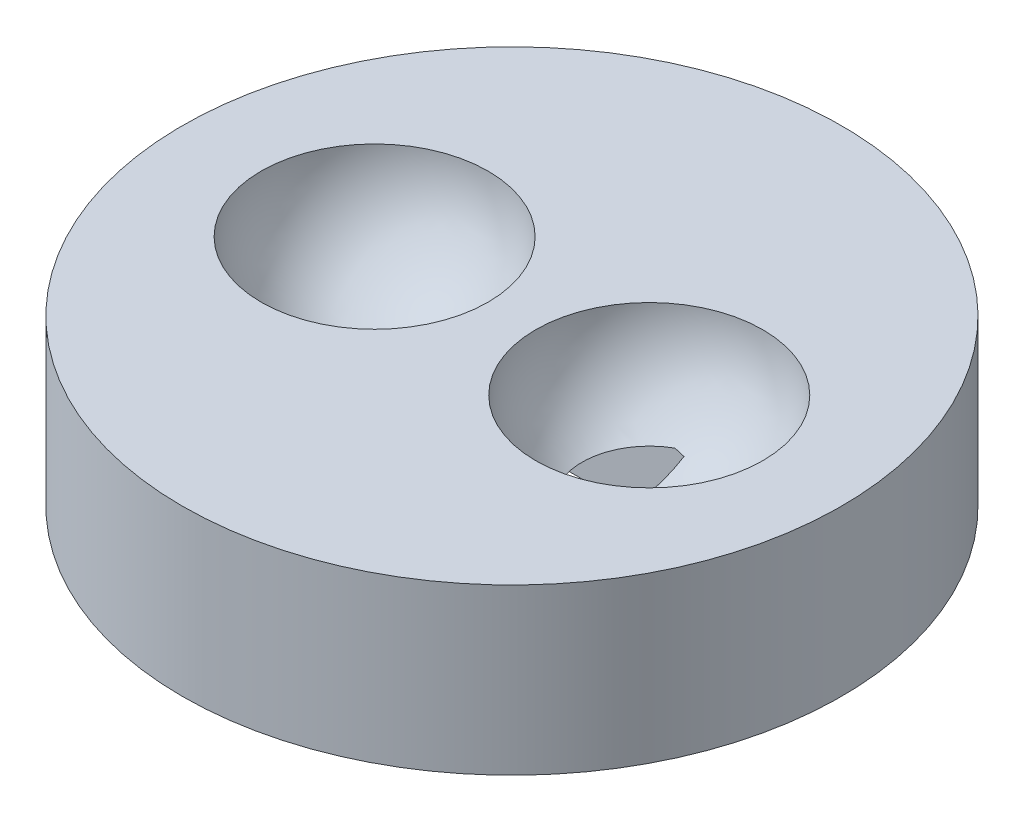
ISO-10303-21;
HEADER;
FILE_DESCRIPTION(('STEP AP214'),'2;1');
FILE_NAME('part.step','',(''),(''),'','','');
FILE_SCHEMA(('AUTOMOTIVE_DESIGN { 1 0 10303 214 1 1 1 1 }'));
ENDSEC;
DATA;
#1=APPLICATION_CONTEXT('core data for automotive mechanical design processes');
#2=APPLICATION_PROTOCOL_DEFINITION('international standard','automotive_design',2000,#1);
#3=PRODUCT_CONTEXT('',#1,'mechanical');
#4=PRODUCT('Part','Part','',(#3));
#5=PRODUCT_RELATED_PRODUCT_CATEGORY('part','',(#4));
#6=PRODUCT_DEFINITION_FORMATION('','',#4);
#7=PRODUCT_DEFINITION_CONTEXT('part definition',#1,'design');
#8=PRODUCT_DEFINITION('design','',#6,#7);
#9=PRODUCT_DEFINITION_SHAPE('','',#8);
#10=(LENGTH_UNIT() NAMED_UNIT(*) SI_UNIT(.MILLI.,.METRE.));
#11=(NAMED_UNIT(*) PLANE_ANGLE_UNIT() SI_UNIT($,.RADIAN.));
#12=(NAMED_UNIT(*) SI_UNIT($,.STERADIAN.) SOLID_ANGLE_UNIT());
#13=UNCERTAINTY_MEASURE_WITH_UNIT(LENGTH_MEASURE(1.E-05),#10,'distance_accuracy_value','');
#14=(GEOMETRIC_REPRESENTATION_CONTEXT(3) GLOBAL_UNCERTAINTY_ASSIGNED_CONTEXT((#13)) GLOBAL_UNIT_ASSIGNED_CONTEXT((#10,
#11,#12)) REPRESENTATION_CONTEXT('',''));
#15=CARTESIAN_POINT('',(0.,0.,0.));
#16=DIRECTION('',(0.,0.,1.));
#17=DIRECTION('',(1.,0.,0.));
#18=AXIS2_PLACEMENT_3D('',#15,#16,#17);
#19=CARTESIAN_POINT('',(0.,4.5,0.));
#20=DIRECTION('',(0.,-1.,0.));
#21=DIRECTION('',(0.,0.,-1.));
#22=AXIS2_PLACEMENT_3D('',#19,#20,#21);
#23=CYLINDRICAL_SURFACE('',#22,9.);
#24=CARTESIAN_POINT('',(0.,4.5,0.));
#25=DIRECTION('',(0.,1.,0.));
#26=DIRECTION('',(0.,0.,1.));
#27=AXIS2_PLACEMENT_3D('',#24,#25,#26);
#28=CIRCLE('',#27,9.);
#29=CARTESIAN_POINT('',(0.,4.5,9.));
#30=VERTEX_POINT('',#29);
#31=EDGE_CURVE('E125',#30,#30,#28,.T.);
#32=ORIENTED_EDGE('',*,*,#31,.F.);
#33=EDGE_LOOP('',(#32));
#34=FACE_BOUND('',#33,.T.);
#35=CARTESIAN_POINT('',(0.,0.,0.));
#36=DIRECTION('',(0.,1.,0.));
#37=DIRECTION('',(0.,0.,1.));
#38=AXIS2_PLACEMENT_3D('',#35,#36,#37);
#39=CIRCLE('',#38,9.);
#40=CARTESIAN_POINT('',(0.,0.,9.));
#41=VERTEX_POINT('',#40);
#42=EDGE_CURVE('E121',#41,#41,#39,.T.);
#43=ORIENTED_EDGE('',*,*,#42,.T.);
#44=EDGE_LOOP('',(#43));
#45=FACE_BOUND('',#44,.T.);
#46=ADVANCED_FACE('F34',(#34,#45),#23,.T.);
#47=CARTESIAN_POINT('',(0.,4.5,0.));
#48=DIRECTION('',(0.,1.,0.));
#49=DIRECTION('',(0.,0.,1.));
#50=AXIS2_PLACEMENT_3D('',#47,#48,#49);
#51=PLANE('',#50);
#52=CARTESIAN_POINT('',(3.75,4.5,0.));
#53=DIRECTION('',(0.,1.,0.));
#54=DIRECTION('',(0.,0.,1.));
#55=AXIS2_PLACEMENT_3D('',#52,#53,#54);
#56=CIRCLE('',#55,3.1);
#57=CARTESIAN_POINT('',(3.75,4.5,3.1));
#58=VERTEX_POINT('',#57);
#59=EDGE_CURVE('E231',#58,#58,#56,.T.);
#60=ORIENTED_EDGE('',*,*,#59,.F.);
#61=EDGE_LOOP('',(#60));
#62=FACE_BOUND('',#61,.T.);
#63=CARTESIAN_POINT('',(-3.75,4.5,0.));
#64=DIRECTION('',(0.,1.,0.));
#65=DIRECTION('',(0.,0.,1.));
#66=AXIS2_PLACEMENT_3D('',#63,#64,#65);
#67=CIRCLE('',#66,3.1);
#68=CARTESIAN_POINT('',(-3.75,4.5,3.1));
#69=VERTEX_POINT('',#68);
#70=EDGE_CURVE('E113',#69,#69,#67,.T.);
#71=ORIENTED_EDGE('',*,*,#70,.F.);
#72=EDGE_LOOP('',(#71));
#73=FACE_BOUND('',#72,.T.);
#74=ORIENTED_EDGE('',*,*,#31,.T.);
#75=EDGE_LOOP('',(#74));
#76=FACE_BOUND('',#75,.T.);
#77=ADVANCED_FACE('F135',(#62,#73,#76),#51,.T.);
#78=CARTESIAN_POINT('',(0.,0.,0.));
#79=DIRECTION('',(0.,1.,0.));
#80=DIRECTION('',(0.,0.,1.));
#81=AXIS2_PLACEMENT_3D('',#78,#79,#80);
#82=PLANE('',#81);
#83=DIRECTION('',(-1.,0.,0.));
#84=VECTOR('',#83,1.);
#85=CARTESIAN_POINT('',(-3.1,0.,1.6));
#86=LINE('',#85,#84);
#87=CARTESIAN_POINT('',(3.1,0.,1.6));
#88=VERTEX_POINT('',#87);
#89=CARTESIAN_POINT('',(-3.1,0.,1.6));
#90=VERTEX_POINT('',#89);
#91=EDGE_CURVE('E112',#88,#90,#86,.T.);
#92=ORIENTED_EDGE('',*,*,#91,.F.);
#93=DIRECTION('',(0.,0.,1.));
#94=VECTOR('',#93,1.);
#95=CARTESIAN_POINT('',(3.1,0.,-1.6));
#96=LINE('',#95,#94);
#97=CARTESIAN_POINT('',(3.1,0.,-1.6));
#98=VERTEX_POINT('',#97);
#99=EDGE_CURVE('E109',#98,#88,#96,.T.);
#100=ORIENTED_EDGE('',*,*,#99,.F.);
#101=DIRECTION('',(1.,0.,0.));
#102=VECTOR('',#101,1.);
#103=CARTESIAN_POINT('',(-3.1,0.,-1.6));
#104=LINE('',#103,#102);
#105=CARTESIAN_POINT('',(-3.1,0.,-1.6));
#106=VERTEX_POINT('',#105);
#107=EDGE_CURVE('E105',#106,#98,#104,.T.);
#108=ORIENTED_EDGE('',*,*,#107,.F.);
#109=DIRECTION('',(0.,0.,-1.));
#110=VECTOR('',#109,1.);
#111=CARTESIAN_POINT('',(-3.1,0.,-1.6));
#112=LINE('',#111,#110);
#113=EDGE_CURVE('E116',#90,#106,#112,.T.);
#114=ORIENTED_EDGE('',*,*,#113,.F.);
#115=EDGE_LOOP('',(#92,#100,#108,#114));
#116=FACE_BOUND('',#115,.T.);
#117=ORIENTED_EDGE('',*,*,#42,.F.);
#118=EDGE_LOOP('',(#117));
#119=FACE_BOUND('',#118,.T.);
#120=ADVANCED_FACE('F132',(#116,#119),#82,.F.);
#121=CARTESIAN_POINT('',(3.1,2.,-1.6));
#122=DIRECTION('',(1.,0.,0.));
#123=DIRECTION('',(0.,0.,-1.));
#124=AXIS2_PLACEMENT_3D('',#121,#122,#123);
#125=PLANE('',#124);
#126=DIRECTION('',(0.,-1.,0.));
#127=VECTOR('',#126,1.);
#128=CARTESIAN_POINT('',(3.1,2.,1.6));
#129=LINE('',#128,#127);
#130=CARTESIAN_POINT('',(3.1,1.9256068676288,1.6));
#131=VERTEX_POINT('',#130);
#132=EDGE_CURVE('E100',#131,#88,#129,.T.);
#133=ORIENTED_EDGE('',*,*,#132,.F.);
#134=CARTESIAN_POINT('',(3.1,4.5,0.));
#135=DIRECTION('',(1.,0.,0.));
#136=DIRECTION('',(0.,0.,-1.));
#137=AXIS2_PLACEMENT_3D('',#134,#135,#136);
#138=CIRCLE('',#137,3.03108891324554);
#139=CARTESIAN_POINT('',(3.1,1.9256068676288,-1.6));
#140=VERTEX_POINT('',#139);
#141=EDGE_CURVE('E97',#131,#140,#138,.T.);
#142=ORIENTED_EDGE('',*,*,#141,.T.);
#143=DIRECTION('',(0.,-1.,0.));
#144=VECTOR('',#143,1.);
#145=CARTESIAN_POINT('',(3.1,2.,-1.6));
#146=LINE('',#145,#144);
#147=EDGE_CURVE('E96',#140,#98,#146,.T.);
#148=ORIENTED_EDGE('',*,*,#147,.T.);
#149=ORIENTED_EDGE('',*,*,#99,.T.);
#150=EDGE_LOOP('',(#133,#142,#148,#149));
#151=FACE_BOUND('',#150,.T.);
#152=ADVANCED_FACE('F134',(#151),#125,.F.);
#153=CARTESIAN_POINT('',(-3.1,2.,-1.6));
#154=DIRECTION('',(0.,0.,-1.));
#155=DIRECTION('',(-1.,0.,0.));
#156=AXIS2_PLACEMENT_3D('',#153,#154,#155);
#157=PLANE('',#156);
#158=ORIENTED_EDGE('',*,*,#147,.F.);
#159=CARTESIAN_POINT('',(3.75,4.5,-1.6));
#160=DIRECTION('',(0.,0.,-1.));
#161=DIRECTION('',(-1.,0.,0.));
#162=AXIS2_PLACEMENT_3D('',#159,#160,#161);
#163=CIRCLE('',#162,2.65518360947035);
#164=CARTESIAN_POINT('',(2.85557280900008,2.,-1.6));
#165=VERTEX_POINT('',#164);
#166=EDGE_CURVE('E85',#140,#165,#163,.T.);
#167=ORIENTED_EDGE('',*,*,#166,.T.);
#168=DIRECTION('',(1.,0.,0.));
#169=VECTOR('',#168,1.);
#170=CARTESIAN_POINT('',(-3.1,2.,-1.6));
#171=LINE('',#170,#169);
#172=CARTESIAN_POINT('',(-2.85557280900008,2.,-1.6));
#173=VERTEX_POINT('',#172);
#174=EDGE_CURVE('E94',#173,#165,#171,.T.);
#175=ORIENTED_EDGE('',*,*,#174,.F.);
#176=CARTESIAN_POINT('',(-3.75,4.5,-1.6));
#177=DIRECTION('',(0.,0.,-1.));
#178=DIRECTION('',(-1.,0.,0.));
#179=AXIS2_PLACEMENT_3D('',#176,#177,#178);
#180=CIRCLE('',#179,2.65518360947035);
#181=CARTESIAN_POINT('',(-3.1,1.9256068676288,-1.6));
#182=VERTEX_POINT('',#181);
#183=EDGE_CURVE('E55',#173,#182,#180,.T.);
#184=ORIENTED_EDGE('',*,*,#183,.T.);
#185=DIRECTION('',(0.,-1.,0.));
#186=VECTOR('',#185,1.);
#187=CARTESIAN_POINT('',(-3.1,2.,-1.6));
#188=LINE('',#187,#186);
#189=EDGE_CURVE('E122',#182,#106,#188,.T.);
#190=ORIENTED_EDGE('',*,*,#189,.T.);
#191=ORIENTED_EDGE('',*,*,#107,.T.);
#192=EDGE_LOOP('',(#158,#167,#175,#184,#190,#191));
#193=FACE_BOUND('',#192,.T.);
#194=ADVANCED_FACE('F93',(#193),#157,.F.);
#195=CARTESIAN_POINT('',(-3.1,2.,-1.6));
#196=DIRECTION('',(-1.,0.,0.));
#197=DIRECTION('',(0.,0.,1.));
#198=AXIS2_PLACEMENT_3D('',#195,#196,#197);
#199=PLANE('',#198);
#200=ORIENTED_EDGE('',*,*,#189,.F.);
#201=CARTESIAN_POINT('',(-3.1,4.5,0.));
#202=DIRECTION('',(-1.,0.,0.));
#203=DIRECTION('',(0.,0.,1.));
#204=AXIS2_PLACEMENT_3D('',#201,#202,#203);
#205=CIRCLE('',#204,3.03108891324554);
#206=CARTESIAN_POINT('',(-3.1,1.9256068676288,1.6));
#207=VERTEX_POINT('',#206);
#208=EDGE_CURVE('E220',#182,#207,#205,.T.);
#209=ORIENTED_EDGE('',*,*,#208,.T.);
#210=DIRECTION('',(0.,-1.,0.));
#211=VECTOR('',#210,1.);
#212=CARTESIAN_POINT('',(-3.1,2.,1.6));
#213=LINE('',#212,#211);
#214=EDGE_CURVE('E103',#207,#90,#213,.T.);
#215=ORIENTED_EDGE('',*,*,#214,.T.);
#216=ORIENTED_EDGE('',*,*,#113,.T.);
#217=EDGE_LOOP('',(#200,#209,#215,#216));
#218=FACE_BOUND('',#217,.T.);
#219=ADVANCED_FACE('F178',(#218),#199,.F.);
#220=CARTESIAN_POINT('',(-3.1,2.,1.6));
#221=DIRECTION('',(0.,0.,1.));
#222=DIRECTION('',(1.,0.,0.));
#223=AXIS2_PLACEMENT_3D('',#220,#221,#222);
#224=PLANE('',#223);
#225=DIRECTION('',(-1.,0.,0.));
#226=VECTOR('',#225,1.);
#227=CARTESIAN_POINT('',(-3.1,2.,1.6));
#228=LINE('',#227,#226);
#229=CARTESIAN_POINT('',(2.85557280900008,2.,1.6));
#230=VERTEX_POINT('',#229);
#231=CARTESIAN_POINT('',(-2.85557280900008,2.,1.6));
#232=VERTEX_POINT('',#231);
#233=EDGE_CURVE('E101',#230,#232,#228,.T.);
#234=ORIENTED_EDGE('',*,*,#233,.F.);
#235=CARTESIAN_POINT('',(3.75,4.5,1.6));
#236=DIRECTION('',(0.,0.,1.));
#237=DIRECTION('',(1.,0.,0.));
#238=AXIS2_PLACEMENT_3D('',#235,#236,#237);
#239=CIRCLE('',#238,2.65518360947035);
#240=EDGE_CURVE('E48',#230,#131,#239,.T.);
#241=ORIENTED_EDGE('',*,*,#240,.T.);
#242=ORIENTED_EDGE('',*,*,#132,.T.);
#243=ORIENTED_EDGE('',*,*,#91,.T.);
#244=ORIENTED_EDGE('',*,*,#214,.F.);
#245=CARTESIAN_POINT('',(-3.75,4.5,1.6));
#246=DIRECTION('',(0.,0.,1.));
#247=DIRECTION('',(1.,0.,0.));
#248=AXIS2_PLACEMENT_3D('',#245,#246,#247);
#249=CIRCLE('',#248,2.65518360947035);
#250=EDGE_CURVE('E226',#207,#232,#249,.T.);
#251=ORIENTED_EDGE('',*,*,#250,.T.);
#252=EDGE_LOOP('',(#234,#241,#242,#243,#244,#251));
#253=FACE_BOUND('',#252,.T.);
#254=ADVANCED_FACE('F185',(#253),#224,.F.);
#255=CARTESIAN_POINT('',(0.,2.,0.));
#256=DIRECTION('',(0.,1.,0.));
#257=DIRECTION('',(0.,0.,1.));
#258=AXIS2_PLACEMENT_3D('',#255,#256,#257);
#259=PLANE('',#258);
#260=ORIENTED_EDGE('',*,*,#174,.T.);
#261=CARTESIAN_POINT('',(3.75,2.,0.));
#262=DIRECTION('',(0.,1.,0.));
#263=DIRECTION('',(0.,0.,1.));
#264=AXIS2_PLACEMENT_3D('',#261,#262,#263);
#265=CIRCLE('',#264,1.83303027798234);
#266=EDGE_CURVE('E11',#165,#230,#265,.T.);
#267=ORIENTED_EDGE('',*,*,#266,.T.);
#268=ORIENTED_EDGE('',*,*,#233,.T.);
#269=CARTESIAN_POINT('',(-3.75,2.,0.));
#270=DIRECTION('',(0.,1.,0.));
#271=DIRECTION('',(0.,0.,1.));
#272=AXIS2_PLACEMENT_3D('',#269,#270,#271);
#273=CIRCLE('',#272,1.83303027798234);
#274=EDGE_CURVE('E41',#232,#173,#273,.T.);
#275=ORIENTED_EDGE('',*,*,#274,.T.);
#276=EDGE_LOOP('',(#260,#267,#268,#275));
#277=FACE_BOUND('',#276,.T.);
#278=ADVANCED_FACE('F99',(#277),#259,.F.);
#279=CARTESIAN_POINT('',(-3.75,4.5,0.));
#280=DIRECTION('',(0.,0.,-1.));
#281=DIRECTION('',(1.,0.,0.));
#282=AXIS2_PLACEMENT_3D('',#279,#280,#281);
#283=SPHERICAL_SURFACE('',#282,3.1);
#284=ORIENTED_EDGE('',*,*,#70,.T.);
#285=EDGE_LOOP('',(#284));
#286=FACE_BOUND('',#285,.T.);
#287=ORIENTED_EDGE('',*,*,#274,.F.);
#288=ORIENTED_EDGE('',*,*,#250,.F.);
#289=ORIENTED_EDGE('',*,*,#208,.F.);
#290=ORIENTED_EDGE('',*,*,#183,.F.);
#291=EDGE_LOOP('',(#287,#288,#289,#290));
#292=FACE_BOUND('',#291,.T.);
#293=ADVANCED_FACE('F163',(#286,#292),#283,.F.);
#294=CARTESIAN_POINT('',(3.75,4.5,0.));
#295=DIRECTION('',(0.,0.,-1.));
#296=DIRECTION('',(-1.,0.,0.));
#297=AXIS2_PLACEMENT_3D('',#294,#295,#296);
#298=SPHERICAL_SURFACE('',#297,3.1);
#299=ORIENTED_EDGE('',*,*,#59,.T.);
#300=EDGE_LOOP('',(#299));
#301=FACE_BOUND('',#300,.T.);
#302=ORIENTED_EDGE('',*,*,#240,.F.);
#303=ORIENTED_EDGE('',*,*,#266,.F.);
#304=ORIENTED_EDGE('',*,*,#166,.F.);
#305=ORIENTED_EDGE('',*,*,#141,.F.);
#306=EDGE_LOOP('',(#302,#303,#304,#305));
#307=FACE_BOUND('',#306,.T.);
#308=ADVANCED_FACE('F84',(#301,#307),#298,.F.);
#309=CLOSED_SHELL('',(#46,#77,#120,#152,#194,#219,#254,#278,#293,#308));
#310=MANIFOLD_SOLID_BREP('B2',#309);
#311=ADVANCED_BREP_SHAPE_REPRESENTATION('',(#18,#310),#14);
#312=SHAPE_DEFINITION_REPRESENTATION(#9,#311);
ENDSEC;
END-ISO-10303-21;
